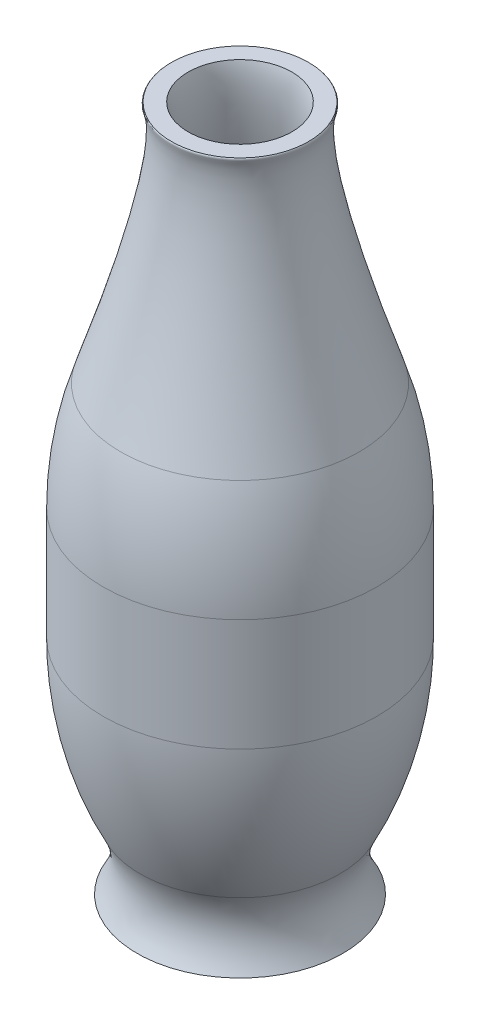
ISO-10303-21;
HEADER;
FILE_DESCRIPTION(('STEP AP214'),'2;1');
FILE_NAME('part.step','',(''),(''),'','','');
FILE_SCHEMA(('AUTOMOTIVE_DESIGN { 1 0 10303 214 1 1 1 1 }'));
ENDSEC;
DATA;
#1=APPLICATION_CONTEXT('core data for automotive mechanical design processes');
#2=APPLICATION_PROTOCOL_DEFINITION('international standard','automotive_design',2000,#1);
#3=PRODUCT_CONTEXT('',#1,'mechanical');
#4=PRODUCT('Part','Part','',(#3));
#5=PRODUCT_RELATED_PRODUCT_CATEGORY('part','',(#4));
#6=PRODUCT_DEFINITION_FORMATION('','',#4);
#7=PRODUCT_DEFINITION_CONTEXT('part definition',#1,'design');
#8=PRODUCT_DEFINITION('design','',#6,#7);
#9=PRODUCT_DEFINITION_SHAPE('','',#8);
#10=(LENGTH_UNIT() NAMED_UNIT(*) SI_UNIT(.MILLI.,.METRE.));
#11=(NAMED_UNIT(*) PLANE_ANGLE_UNIT() SI_UNIT($,.RADIAN.));
#12=(NAMED_UNIT(*) SI_UNIT($,.STERADIAN.) SOLID_ANGLE_UNIT());
#13=UNCERTAINTY_MEASURE_WITH_UNIT(LENGTH_MEASURE(1.E-05),#10,'distance_accuracy_value','');
#14=(GEOMETRIC_REPRESENTATION_CONTEXT(3) GLOBAL_UNCERTAINTY_ASSIGNED_CONTEXT((#13)) GLOBAL_UNIT_ASSIGNED_CONTEXT((#10,
#11,#12)) REPRESENTATION_CONTEXT('',''));
#15=CARTESIAN_POINT('',(0.,0.,0.));
#16=DIRECTION('',(0.,0.,1.));
#17=DIRECTION('',(1.,0.,0.));
#18=AXIS2_PLACEMENT_3D('',#15,#16,#17);
#19=CARTESIAN_POINT('',(1.20011770019137,5.31924925223305,-1.77116026636381E-06));
#20=DIRECTION('',(0.,-1.,0.));
#21=DIRECTION('',(0.,0.,-1.));
#22=AXIS2_PLACEMENT_3D('',#19,#20,#21);
#23=PLANE('',#22);
#24=CARTESIAN_POINT('',(0.,5.31924925223305,-1.77116026636381E-06));
#25=DIRECTION('',(0.,-1.,0.));
#26=DIRECTION('',(0.,0.,-1.));
#27=AXIS2_PLACEMENT_3D('',#24,#25,#26);
#28=CIRCLE('',#27,1.20011770019137);
#29=CARTESIAN_POINT('',(0.,5.31924925223305,-1.20011947135164));
#30=VERTEX_POINT('',#29);
#31=EDGE_CURVE('E10',#30,#30,#28,.T.);
#32=ORIENTED_EDGE('',*,*,#31,.T.);
#33=EDGE_LOOP('',(#32));
#34=FACE_BOUND('',#33,.T.);
#35=ADVANCED_FACE('F34',(#34),#23,.T.);
#36=CARTESIAN_POINT('',(1.20011770019137,5.31924925223305,-1.77116026636381E-06));
#37=CARTESIAN_POINT('',(1.10837789316419,5.47044353997899,-1.77116026636381E-06));
#38=CARTESIAN_POINT('',(1.03000604394087,5.74384644755028,-1.77116026636381E-06));
#39=CARTESIAN_POINT('',(1.10358912437252,5.98504635924202,-1.77116026636381E-06));
#40=CARTESIAN_POINT('',(1.16380424700015,6.10403765110795,-1.77116026636381E-06));
#41=B_SPLINE_CURVE_WITH_KNOTS('',3,(#36,#37,#38,#39,#40),.UNSPECIFIED.,.F.,.F.,(4,1,4),
(0.735355326307228,0.771879528610345,0.808403730913462),.UNSPECIFIED.);
#42=CARTESIAN_POINT('',(0.,5.31924925223306,-1.77116026636381E-06));
#43=DIRECTION('',(0.,-1.,0.));
#44=AXIS1_PLACEMENT('',#42,#43);
#45=SURFACE_OF_REVOLUTION('',#41,#44);
#46=CARTESIAN_POINT('',(0.,6.10403765110795,-1.77116026636381E-06));
#47=DIRECTION('',(0.,-1.,0.));
#48=DIRECTION('',(0.,0.,-1.));
#49=AXIS2_PLACEMENT_3D('',#46,#47,#48);
#50=CIRCLE('',#49,1.16380424700015);
#51=CARTESIAN_POINT('',(0.,6.10403765110795,-1.16380601816041));
#52=VERTEX_POINT('',#51);
#53=EDGE_CURVE('E40',#52,#52,#50,.T.);
#54=ORIENTED_EDGE('',*,*,#53,.T.);
#55=EDGE_LOOP('',(#54));
#56=FACE_BOUND('',#55,.T.);
#57=ORIENTED_EDGE('',*,*,#31,.F.);
#58=EDGE_LOOP('',(#57));
#59=FACE_BOUND('',#58,.T.);
#60=ADVANCED_FACE('F88',(#56,#59),#45,.F.);
#61=CARTESIAN_POINT('',(0.,7.91013524324894,-1.77116026636381E-06));
#62=DIRECTION('',(0.,-1.,0.));
#63=DIRECTION('',(0.,0.,-1.));
#64=AXIS2_PLACEMENT_3D('',#61,#62,#63);
#65=DEGENERATE_TOROIDAL_SURFACE('',#64,2.40523084496274,4.,.F.);
#66=CARTESIAN_POINT('',(0.,7.91013524324894,-1.77116026636381E-06));
#67=DIRECTION('',(0.,-1.,0.));
#68=DIRECTION('',(0.,0.,-1.));
#69=AXIS2_PLACEMENT_3D('',#66,#67,#68);
#70=CIRCLE('',#69,1.59476915503726);
#71=CARTESIAN_POINT('',(0.,7.91013524324894,-1.59477092619753));
#72=VERTEX_POINT('',#71);
#73=EDGE_CURVE('E44',#72,#72,#70,.T.);
#74=ORIENTED_EDGE('',*,*,#73,.T.);
#75=EDGE_LOOP('',(#74));
#76=FACE_BOUND('',#75,.T.);
#77=ORIENTED_EDGE('',*,*,#53,.F.);
#78=EDGE_LOOP('',(#77));
#79=FACE_BOUND('',#78,.T.);
#80=ADVANCED_FACE('F85',(#76,#79),#65,.F.);
#81=CARTESIAN_POINT('',(0.,5.31924925223306,-1.77116026636381E-06));
#82=DIRECTION('',(0.,-1.,0.));
#83=DIRECTION('',(0.,0.,-1.));
#84=AXIS2_PLACEMENT_3D('',#81,#82,#83);
#85=CYLINDRICAL_SURFACE('',#84,1.59476915503726);
#86=CARTESIAN_POINT('',(0.,9.21740753646573,-1.77116026636381E-06));
#87=DIRECTION('',(0.,-1.,0.));
#88=DIRECTION('',(0.,0.,-1.));
#89=AXIS2_PLACEMENT_3D('',#86,#87,#88);
#90=CIRCLE('',#89,1.59476915503726);
#91=CARTESIAN_POINT('',(0.,9.21740753646573,-1.59477092619753));
#92=VERTEX_POINT('',#91);
#93=EDGE_CURVE('E48',#92,#92,#90,.T.);
#94=ORIENTED_EDGE('',*,*,#93,.T.);
#95=EDGE_LOOP('',(#94));
#96=FACE_BOUND('',#95,.T.);
#97=ORIENTED_EDGE('',*,*,#73,.F.);
#98=EDGE_LOOP('',(#97));
#99=FACE_BOUND('',#98,.T.);
#100=ADVANCED_FACE('F82',(#96,#99),#85,.T.);
#101=CARTESIAN_POINT('',(0.,9.21740753646573,-1.77116026636381E-06));
#102=DIRECTION('',(0.,-1.,0.));
#103=DIRECTION('',(0.,0.,-1.));
#104=AXIS2_PLACEMENT_3D('',#101,#102,#103);
#105=DEGENERATE_TOROIDAL_SURFACE('',#104,2.40523084496274,4.,.F.);
#106=CARTESIAN_POINT('',(0.,10.4793628348042,-1.77116026636381E-06));
#107=DIRECTION('',(0.,-1.,0.));
#108=DIRECTION('',(0.,0.,-1.));
#109=AXIS2_PLACEMENT_3D('',#106,#107,#108);
#110=CIRCLE('',#109,1.39048632376777);
#111=CARTESIAN_POINT('',(0.,10.4793628348042,-1.39048809492804));
#112=VERTEX_POINT('',#111);
#113=EDGE_CURVE('E53',#112,#112,#110,.T.);
#114=ORIENTED_EDGE('',*,*,#113,.T.);
#115=EDGE_LOOP('',(#114));
#116=FACE_BOUND('',#115,.T.);
#117=ORIENTED_EDGE('',*,*,#93,.F.);
#118=EDGE_LOOP('',(#117));
#119=FACE_BOUND('',#118,.T.);
#120=ADVANCED_FACE('F77',(#116,#119),#105,.F.);
#121=CARTESIAN_POINT('',(1.39048632376777,10.4793628348042,-1.77116026636381E-06));
#122=CARTESIAN_POINT('',(0.935103507229633,11.8490661652993,-1.77116026636381E-06));
#123=CARTESIAN_POINT('',(0.669820487546058,13.2381016237034,-1.77116026636381E-06));
#124=CARTESIAN_POINT('',(0.829960142196954,13.2883415019247,-1.77116026636381E-06));
#125=CARTESIAN_POINT('',(0.8,13.3192492522331,-1.77116026636381E-06));
#126=B_SPLINE_CURVE_WITH_KNOTS('',3,(#121,#122,#123,#124,#125),.UNSPECIFIED.,.F.,.F.,(4,1,4),
(0.,0.230050180885169,0.460100361770339),.UNSPECIFIED.);
#127=CARTESIAN_POINT('',(0.,5.31924925223306,-1.77116026636381E-06));
#128=DIRECTION('',(0.,-1.,0.));
#129=AXIS1_PLACEMENT('',#127,#128);
#130=SURFACE_OF_REVOLUTION('',#126,#129);
#131=CARTESIAN_POINT('',(0.,13.3192492522331,-1.77116026636381E-06));
#132=DIRECTION('',(0.,-1.,0.));
#133=DIRECTION('',(0.,0.,-1.));
#134=AXIS2_PLACEMENT_3D('',#131,#132,#133);
#135=CIRCLE('',#134,0.8);
#136=CARTESIAN_POINT('',(0.,13.3192492522331,-0.800001771160266));
#137=VERTEX_POINT('',#136);
#138=EDGE_CURVE('E56',#137,#137,#135,.T.);
#139=ORIENTED_EDGE('',*,*,#138,.T.);
#140=EDGE_LOOP('',(#139));
#141=FACE_BOUND('',#140,.T.);
#142=ORIENTED_EDGE('',*,*,#113,.F.);
#143=EDGE_LOOP('',(#142));
#144=FACE_BOUND('',#143,.T.);
#145=ADVANCED_FACE('F72',(#141,#144),#130,.F.);
#146=CARTESIAN_POINT('',(0.,13.3192492522331,-1.77116026636381E-06));
#147=DIRECTION('',(0.,1.,0.));
#148=DIRECTION('',(0.,0.,1.));
#149=AXIS2_PLACEMENT_3D('',#146,#147,#148);
#150=PLANE('',#149);
#151=CARTESIAN_POINT('',(0.,13.3192492522331,-1.77116026636381E-06));
#152=DIRECTION('',(0.,-1.,0.));
#153=DIRECTION('',(0.,0.,-1.));
#154=AXIS2_PLACEMENT_3D('',#151,#152,#153);
#155=CIRCLE('',#154,0.605016063477041);
#156=CARTESIAN_POINT('',(0.,13.3192492522331,-0.605017834637308));
#157=VERTEX_POINT('',#156);
#158=EDGE_CURVE('E59',#157,#157,#155,.F.);
#159=ORIENTED_EDGE('',*,*,#158,.F.);
#160=EDGE_LOOP('',(#159));
#161=FACE_BOUND('',#160,.T.);
#162=ORIENTED_EDGE('',*,*,#138,.F.);
#163=EDGE_LOOP('',(#162));
#164=FACE_BOUND('',#163,.T.);
#165=ADVANCED_FACE('F76',(#161,#164),#150,.T.);
#166=CARTESIAN_POINT('',(1.20011770019137,5.51924925223305,-1.77116026636381E-06));
#167=DIRECTION('',(0.,-1.,0.));
#168=DIRECTION('',(0.,0.,-1.));
#169=AXIS2_PLACEMENT_3D('',#166,#167,#168);
#170=PLANE('',#169);
#171=CARTESIAN_POINT('',(0.,5.51924925223305,-1.77116026636381E-06));
#172=DIRECTION('',(0.,-1.,0.));
#173=DIRECTION('',(0.,0.,-1.));
#174=AXIS2_PLACEMENT_3D('',#171,#172,#173);
#175=CIRCLE('',#174,0.896960294979011);
#176=CARTESIAN_POINT('',(0.,5.51924925223305,-0.896962066139277));
#177=VERTEX_POINT('',#176);
#178=EDGE_CURVE('E208',#177,#177,#175,.T.);
#179=ORIENTED_EDGE('',*,*,#178,.F.);
#180=EDGE_LOOP('',(#179));
#181=FACE_BOUND('',#180,.T.);
#182=ADVANCED_FACE('F133',(#181),#170,.F.);
#183=CARTESIAN_POINT('',(1.20011770019137,5.31924925223305,-1.77116026636381E-06));
#184=CARTESIAN_POINT('',(1.10837789316419,5.47044353997899,-1.77116026636381E-06));
#185=CARTESIAN_POINT('',(1.03000604394087,5.74384644755028,-1.77116026636381E-06));
#186=CARTESIAN_POINT('',(1.10358912437252,5.98504635924202,-1.77116026636381E-06));
#187=CARTESIAN_POINT('',(1.16380424700015,6.10403765110795,-1.77116026636381E-06));
#188=B_SPLINE_CURVE_WITH_KNOTS('',3,(#183,#184,#185,#186,#187),.UNSPECIFIED.,.F.,.F.,(4,1,4),
(0.735355326307228,0.771879528610345,0.808403730913462),.UNSPECIFIED.);
#189=CARTESIAN_POINT('',(0.,5.31924925223306,-1.77116026636381E-06));
#190=DIRECTION('',(0.,-1.,0.));
#191=AXIS1_PLACEMENT('',#189,#190);
#192=SURFACE_OF_REVOLUTION('',#188,#191);
#193=OFFSET_SURFACE('',#192,0.2,.F.);
#194=CARTESIAN_POINT('',(0.,6.19434253071501,-1.77116026636381E-06));
#195=DIRECTION('',(0.,-1.,0.));
#196=DIRECTION('',(1.,0.,0.));
#197=AXIS2_PLACEMENT_3D('',#194,#195,#196);
#198=CIRCLE('',#197,0.98535249240201);
#199=CARTESIAN_POINT('',(0.98535249240201,6.19434253071501,-1.77116026636381E-06));
#200=VERTEX_POINT('',#199);
#201=EDGE_CURVE('E218',#200,#200,#198,.T.);
#202=ORIENTED_EDGE('',*,*,#201,.F.);
#203=EDGE_LOOP('',(#202));
#204=FACE_BOUND('',#203,.T.);
#205=ORIENTED_EDGE('',*,*,#178,.T.);
#206=EDGE_LOOP('',(#205));
#207=FACE_BOUND('',#206,.T.);
#208=ADVANCED_FACE('F142',(#204,#207),#193,.T.);
#209=CARTESIAN_POINT('',(0.,7.91013524324894,-1.77116026636381E-06));
#210=DIRECTION('',(0.,-1.,0.));
#211=DIRECTION('',(0.,0.,-1.));
#212=AXIS2_PLACEMENT_3D('',#209,#210,#211);
#213=DEGENERATE_TOROIDAL_SURFACE('',#212,2.40523084496274,3.8,.F.);
#214=CARTESIAN_POINT('',(0.,7.91013524324894,-1.77116026636381E-06));
#215=DIRECTION('',(0.,-1.,0.));
#216=DIRECTION('',(0.,0.,-1.));
#217=AXIS2_PLACEMENT_3D('',#214,#215,#216);
#218=CIRCLE('',#217,1.39476915503726);
#219=CARTESIAN_POINT('',(0.,7.91013524324894,-1.39477092619753));
#220=VERTEX_POINT('',#219);
#221=EDGE_CURVE('E215',#220,#220,#218,.T.);
#222=ORIENTED_EDGE('',*,*,#221,.F.);
#223=EDGE_LOOP('',(#222));
#224=FACE_BOUND('',#223,.T.);
#225=ORIENTED_EDGE('',*,*,#201,.T.);
#226=EDGE_LOOP('',(#225));
#227=FACE_BOUND('',#226,.T.);
#228=ADVANCED_FACE('F152',(#224,#227),#213,.T.);
#229=CARTESIAN_POINT('',(0.,5.31924925223306,-1.77116026636381E-06));
#230=DIRECTION('',(0.,-1.,0.));
#231=DIRECTION('',(0.,0.,-1.));
#232=AXIS2_PLACEMENT_3D('',#229,#230,#231);
#233=CYLINDRICAL_SURFACE('',#232,1.39476915503726);
#234=CARTESIAN_POINT('',(0.,9.21740753646573,-1.77116026636381E-06));
#235=DIRECTION('',(0.,-1.,0.));
#236=DIRECTION('',(0.,0.,-1.));
#237=AXIS2_PLACEMENT_3D('',#234,#235,#236);
#238=CIRCLE('',#237,1.39476915503726);
#239=CARTESIAN_POINT('',(0.,9.21740753646573,-1.39477092619753));
#240=VERTEX_POINT('',#239);
#241=EDGE_CURVE('E212',#240,#240,#238,.T.);
#242=ORIENTED_EDGE('',*,*,#241,.F.);
#243=EDGE_LOOP('',(#242));
#244=FACE_BOUND('',#243,.T.);
#245=ORIENTED_EDGE('',*,*,#221,.T.);
#246=EDGE_LOOP('',(#245));
#247=FACE_BOUND('',#246,.T.);
#248=ADVANCED_FACE('F162',(#244,#247),#233,.F.);
#249=CARTESIAN_POINT('',(0.,9.21740753646573,-1.77116026636381E-06));
#250=DIRECTION('',(0.,-1.,0.));
#251=DIRECTION('',(0.,0.,-1.));
#252=AXIS2_PLACEMENT_3D('',#249,#250,#251);
#253=DEGENERATE_TOROIDAL_SURFACE('',#252,2.40523084496274,3.8,.F.);
#254=CARTESIAN_POINT('',(0.,10.4162650698872,-1.77116026636381E-06));
#255=DIRECTION('',(0.,-1.,0.));
#256=DIRECTION('',(0.,0.,-1.));
#257=AXIS2_PLACEMENT_3D('',#254,#255,#256);
#258=CIRCLE('',#257,1.20070046533124);
#259=CARTESIAN_POINT('',(0.,10.4162650698872,-1.20070223649151));
#260=VERTEX_POINT('',#259);
#261=EDGE_CURVE('E209',#260,#260,#258,.T.);
#262=ORIENTED_EDGE('',*,*,#261,.F.);
#263=EDGE_LOOP('',(#262));
#264=FACE_BOUND('',#263,.T.);
#265=ORIENTED_EDGE('',*,*,#241,.T.);
#266=EDGE_LOOP('',(#265));
#267=FACE_BOUND('',#266,.T.);
#268=ADVANCED_FACE('F172',(#264,#267),#253,.T.);
#269=CARTESIAN_POINT('',(1.39048632376777,10.4793628348042,-1.77116026636381E-06));
#270=CARTESIAN_POINT('',(0.935103507229633,11.8490661652993,-1.77116026636381E-06));
#271=CARTESIAN_POINT('',(0.707100461702643,13.0429017724138,-1.77116026636381E-06));
#272=CARTESIAN_POINT('',(0.793353015591697,13.2477820818257,-1.77116026636381E-06));
#273=CARTESIAN_POINT('',(0.803990764354483,13.287000808324,-1.77116026636381E-06));
#274=B_SPLINE_CURVE_WITH_KNOTS('',3,(#269,#270,#271,#272,#273),.UNSPECIFIED.,.F.,.F.,(4,1,4),
(0.,0.230050180885169,0.395442889095711),.UNSPECIFIED.);
#275=CARTESIAN_POINT('',(0.,5.31924925223306,-1.77116026636381E-06));
#276=DIRECTION('',(0.,-1.,0.));
#277=AXIS1_PLACEMENT('',#275,#276);
#278=SURFACE_OF_REVOLUTION('',#274,#277);
#279=OFFSET_SURFACE('',#278,0.2,.F.);
#280=ORIENTED_EDGE('',*,*,#158,.T.);
#281=EDGE_LOOP('',(#280));
#282=FACE_BOUND('',#281,.T.);
#283=ORIENTED_EDGE('',*,*,#261,.T.);
#284=EDGE_LOOP('',(#283));
#285=FACE_BOUND('',#284,.T.);
#286=ADVANCED_FACE('F182',(#282,#285),#279,.T.);
#287=CLOSED_SHELL('',(#35,#60,#80,#100,#120,#145,#165,#182,#208,#228,#248,#268,#286));
#288=MANIFOLD_SOLID_BREP('B2',#287);
#289=ADVANCED_BREP_SHAPE_REPRESENTATION('',(#18,#288),#14);
#290=SHAPE_DEFINITION_REPRESENTATION(#9,#289);
ENDSEC;
END-ISO-10303-21;
